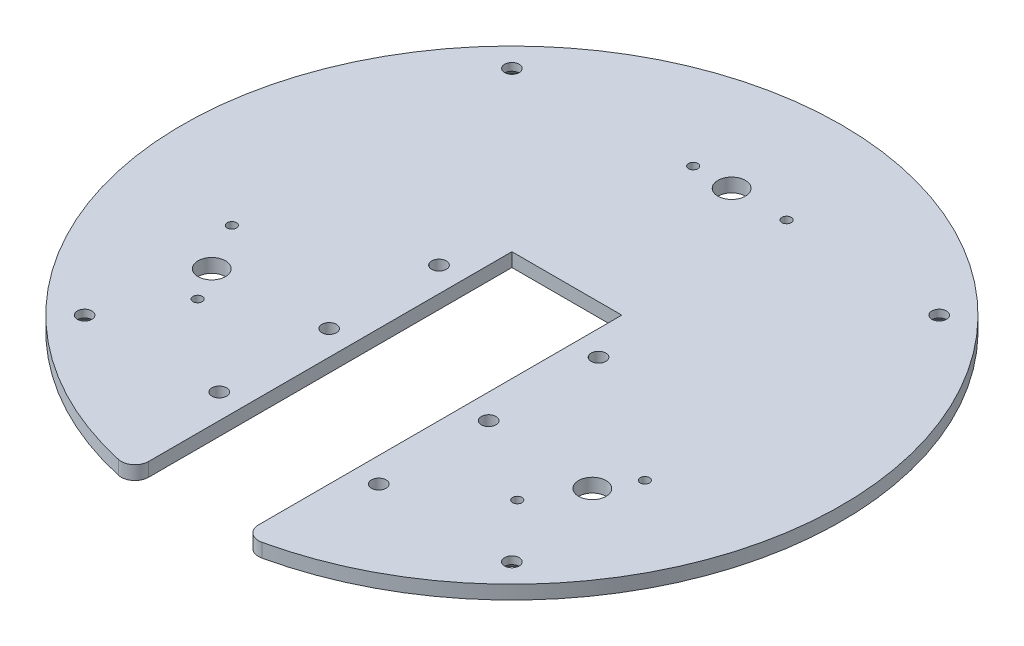
ISO-10303-21;
HEADER;
FILE_DESCRIPTION(('STEP AP214'),'2;1');
FILE_NAME('part.step','',(''),(''),'','','');
FILE_SCHEMA(('AUTOMOTIVE_DESIGN { 1 0 10303 214 1 1 1 1 }'));
ENDSEC;
DATA;
#1=APPLICATION_CONTEXT('core data for automotive mechanical design processes');
#2=APPLICATION_PROTOCOL_DEFINITION('international standard','automotive_design',2000,#1);
#3=PRODUCT_CONTEXT('',#1,'mechanical');
#4=PRODUCT('Part','Part','',(#3));
#5=PRODUCT_RELATED_PRODUCT_CATEGORY('part','',(#4));
#6=PRODUCT_DEFINITION_FORMATION('','',#4);
#7=PRODUCT_DEFINITION_CONTEXT('part definition',#1,'design');
#8=PRODUCT_DEFINITION('design','',#6,#7);
#9=PRODUCT_DEFINITION_SHAPE('','',#8);
#10=(LENGTH_UNIT() NAMED_UNIT(*) SI_UNIT(.MILLI.,.METRE.));
#11=(NAMED_UNIT(*) PLANE_ANGLE_UNIT() SI_UNIT($,.RADIAN.));
#12=(NAMED_UNIT(*) SI_UNIT($,.STERADIAN.) SOLID_ANGLE_UNIT());
#13=UNCERTAINTY_MEASURE_WITH_UNIT(LENGTH_MEASURE(1.E-05),#10,'distance_accuracy_value','');
#14=(GEOMETRIC_REPRESENTATION_CONTEXT(3) GLOBAL_UNCERTAINTY_ASSIGNED_CONTEXT((#13)) GLOBAL_UNIT_ASSIGNED_CONTEXT((#10,
#11,#12)) REPRESENTATION_CONTEXT('',''));
#15=CARTESIAN_POINT('',(0.,0.,0.));
#16=DIRECTION('',(0.,0.,1.));
#17=DIRECTION('',(1.,0.,0.));
#18=AXIS2_PLACEMENT_3D('',#15,#16,#17);
#19=CARTESIAN_POINT('',(-98.7828173317604,1.13686837721616E-10,-98.7828173317604));
#20=DIRECTION('',(0.,-1.,0.));
#21=DIRECTION('',(0.,0.,-1.));
#22=AXIS2_PLACEMENT_3D('',#19,#20,#21);
#23=CONICAL_SURFACE('',#22,6.22299999992661,0.785398163397448);
#24=CARTESIAN_POINT('',(-98.7828173317604,2.8448,-98.7828173317604));
#25=DIRECTION('',(0.,1.,0.));
#26=DIRECTION('',(0.,0.,1.));
#27=AXIS2_PLACEMENT_3D('',#24,#25,#26);
#28=CIRCLE('',#27,3.3782);
#29=CARTESIAN_POINT('',(-98.7828173317604,2.8448,-95.4046173317604));
#30=VERTEX_POINT('',#29);
#31=EDGE_CURVE('E126',#30,#30,#28,.T.);
#32=ORIENTED_EDGE('',*,*,#31,.T.);
#33=EDGE_LOOP('',(#32));
#34=FACE_BOUND('',#33,.T.);
#35=CARTESIAN_POINT('',(-98.7828173317604,5.6843418860808E-11,-98.7828173317604));
#36=DIRECTION('',(0.,-1.,0.));
#37=DIRECTION('',(0.,0.,-1.));
#38=AXIS2_PLACEMENT_3D('',#35,#36,#37);
#39=CIRCLE('',#38,6.22299999998345);
#40=CARTESIAN_POINT('',(-98.7828173317604,5.6843418860808E-11,-105.005817331744));
#41=VERTEX_POINT('',#40);
#42=EDGE_CURVE('E234',#41,#41,#39,.T.);
#43=ORIENTED_EDGE('',*,*,#42,.T.);
#44=EDGE_LOOP('',(#43));
#45=FACE_BOUND('',#44,.T.);
#46=ADVANCED_FACE('F16',(#34,#45),#23,.F.);
#47=CARTESIAN_POINT('',(-98.7828173317604,5.6843418860808E-11,98.7828173317604));
#48=DIRECTION('',(0.,-1.,0.));
#49=DIRECTION('',(0.,0.,-1.));
#50=AXIS2_PLACEMENT_3D('',#47,#48,#49);
#51=CONICAL_SURFACE('',#50,6.22299999997099,0.785398163397448);
#52=CARTESIAN_POINT('',(-98.7828173317604,2.8448,98.7828173317604));
#53=DIRECTION('',(0.,1.,0.));
#54=DIRECTION('',(0.,0.,1.));
#55=AXIS2_PLACEMENT_3D('',#52,#53,#54);
#56=CIRCLE('',#55,3.3782);
#57=CARTESIAN_POINT('',(-98.7828173317604,2.8448,102.16101733176));
#58=VERTEX_POINT('',#57);
#59=EDGE_CURVE('E123',#58,#58,#56,.T.);
#60=ORIENTED_EDGE('',*,*,#59,.T.);
#61=EDGE_LOOP('',(#60));
#62=FACE_BOUND('',#61,.T.);
#63=CARTESIAN_POINT('',(-98.7828173317604,-5.6843418860808E-11,98.7828173317604));
#64=DIRECTION('',(0.,-1.,0.));
#65=DIRECTION('',(0.,0.,-1.));
#66=AXIS2_PLACEMENT_3D('',#63,#64,#65);
#67=CIRCLE('',#66,6.22300000008467);
#68=CARTESIAN_POINT('',(-98.7828173317604,-5.6843418860808E-11,92.5598173316757));
#69=VERTEX_POINT('',#68);
#70=EDGE_CURVE('E231',#69,#69,#67,.T.);
#71=ORIENTED_EDGE('',*,*,#70,.T.);
#72=EDGE_LOOP('',(#71));
#73=FACE_BOUND('',#72,.T.);
#74=ADVANCED_FACE('F378',(#62,#73),#51,.F.);
#75=CARTESIAN_POINT('',(98.7828173317604,5.6843418860808E-11,98.7828173317604));
#76=DIRECTION('',(0.,-1.,0.));
#77=DIRECTION('',(0.,0.,-1.));
#78=AXIS2_PLACEMENT_3D('',#75,#76,#77);
#79=CONICAL_SURFACE('',#78,6.22299999997099,0.785398163397448);
#80=CARTESIAN_POINT('',(98.7828173317604,2.8448,98.7828173317604));
#81=DIRECTION('',(0.,1.,0.));
#82=DIRECTION('',(0.,0.,1.));
#83=AXIS2_PLACEMENT_3D('',#80,#81,#82);
#84=CIRCLE('',#83,3.3782);
#85=CARTESIAN_POINT('',(98.7828173317604,2.8448,102.16101733176));
#86=VERTEX_POINT('',#85);
#87=EDGE_CURVE('E120',#86,#86,#84,.T.);
#88=ORIENTED_EDGE('',*,*,#87,.T.);
#89=EDGE_LOOP('',(#88));
#90=FACE_BOUND('',#89,.T.);
#91=CARTESIAN_POINT('',(98.7828173317604,-5.6843418860808E-11,98.7828173317604));
#92=DIRECTION('',(0.,-1.,0.));
#93=DIRECTION('',(0.,0.,-1.));
#94=AXIS2_PLACEMENT_3D('',#91,#92,#93);
#95=CIRCLE('',#94,6.22300000008467);
#96=CARTESIAN_POINT('',(98.7828173317604,-5.6843418860808E-11,92.5598173316757));
#97=VERTEX_POINT('',#96);
#98=EDGE_CURVE('E88',#97,#97,#95,.T.);
#99=ORIENTED_EDGE('',*,*,#98,.T.);
#100=EDGE_LOOP('',(#99));
#101=FACE_BOUND('',#100,.T.);
#102=ADVANCED_FACE('F375',(#90,#101),#79,.F.);
#103=CARTESIAN_POINT('',(98.7828173317604,1.13686837721616E-10,-98.7828173317604));
#104=DIRECTION('',(0.,-1.,0.));
#105=DIRECTION('',(0.,0.,-1.));
#106=AXIS2_PLACEMENT_3D('',#103,#104,#105);
#107=CONICAL_SURFACE('',#106,6.22299999992661,0.785398163397448);
#108=CARTESIAN_POINT('',(98.7828173317604,2.8448,-98.7828173317604));
#109=DIRECTION('',(0.,1.,0.));
#110=DIRECTION('',(0.,0.,1.));
#111=AXIS2_PLACEMENT_3D('',#108,#109,#110);
#112=CIRCLE('',#111,3.3782);
#113=CARTESIAN_POINT('',(98.7828173317604,2.8448,-95.4046173317604));
#114=VERTEX_POINT('',#113);
#115=EDGE_CURVE('E117',#114,#114,#112,.T.);
#116=ORIENTED_EDGE('',*,*,#115,.T.);
#117=EDGE_LOOP('',(#116));
#118=FACE_BOUND('',#117,.T.);
#119=CARTESIAN_POINT('',(98.7828173317604,5.6843418860808E-11,-98.7828173317604));
#120=DIRECTION('',(0.,-1.,0.));
#121=DIRECTION('',(0.,0.,-1.));
#122=AXIS2_PLACEMENT_3D('',#119,#120,#121);
#123=CIRCLE('',#122,6.22299999998345);
#124=CARTESIAN_POINT('',(98.7828173317604,5.6843418860808E-11,-105.005817331744));
#125=VERTEX_POINT('',#124);
#126=EDGE_CURVE('E237',#125,#125,#123,.T.);
#127=ORIENTED_EDGE('',*,*,#126,.T.);
#128=EDGE_LOOP('',(#127));
#129=FACE_BOUND('',#128,.T.);
#130=ADVANCED_FACE('F369',(#118,#129),#107,.F.);
#131=CARTESIAN_POINT('',(-79.0981810245052,1.13686837721616E-10,66.1979316792846));
#132=DIRECTION('',(0.,-1.,0.));
#133=DIRECTION('',(0.,0.,-1.));
#134=AXIS2_PLACEMENT_3D('',#131,#132,#133);
#135=CONICAL_SURFACE('',#134,4.99744999993448,0.785398163387458);
#136=CARTESIAN_POINT('',(-79.0981810245052,2.8448,66.1979316792846));
#137=DIRECTION('',(0.,1.,0.));
#138=DIRECTION('',(0.,0.,1.));
#139=AXIS2_PLACEMENT_3D('',#136,#137,#138);
#140=CIRCLE('',#139,2.15265);
#141=CARTESIAN_POINT('',(-79.0981810245052,2.8448,68.3505816792846));
#142=VERTEX_POINT('',#141);
#143=EDGE_CURVE('E114',#142,#142,#140,.T.);
#144=ORIENTED_EDGE('',*,*,#143,.T.);
#145=EDGE_LOOP('',(#144));
#146=FACE_BOUND('',#145,.T.);
#147=CARTESIAN_POINT('',(-79.0981810245052,5.6843418860808E-11,66.1979316792846));
#148=DIRECTION('',(0.,-1.,0.));
#149=DIRECTION('',(0.,0.,-1.));
#150=AXIS2_PLACEMENT_3D('',#147,#148,#149);
#151=CIRCLE('',#150,4.99744999999133);
#152=CARTESIAN_POINT('',(-79.0981810245052,5.6843418860808E-11,61.2004816792933));
#153=VERTEX_POINT('',#152);
#154=EDGE_CURVE('E246',#153,#153,#151,.T.);
#155=ORIENTED_EDGE('',*,*,#154,.T.);
#156=EDGE_LOOP('',(#155));
#157=FACE_BOUND('',#156,.T.);
#158=ADVANCED_FACE('F360',(#146,#157),#135,.F.);
#159=CARTESIAN_POINT('',(-100.688181024505,2.27373675443232E-10,28.8029547438864));
#160=DIRECTION('',(0.,-1.,0.));
#161=DIRECTION('',(0.,0.,-1.));
#162=AXIS2_PLACEMENT_3D('',#159,#160,#161);
#163=CONICAL_SURFACE('',#162,4.99744999981112,0.785398163397448);
#164=CARTESIAN_POINT('',(-100.688181024505,2.8448,28.8029547438864));
#165=DIRECTION('',(0.,1.,0.));
#166=DIRECTION('',(0.,0.,1.));
#167=AXIS2_PLACEMENT_3D('',#164,#165,#166);
#168=CIRCLE('',#167,2.15265);
#169=CARTESIAN_POINT('',(-100.688181024505,2.8448,30.9556047438864));
#170=VERTEX_POINT('',#169);
#171=EDGE_CURVE('E111',#170,#170,#168,.T.);
#172=ORIENTED_EDGE('',*,*,#171,.T.);
#173=EDGE_LOOP('',(#172));
#174=FACE_BOUND('',#173,.T.);
#175=CARTESIAN_POINT('',(-100.688181024505,5.6843418860808E-11,28.8029547438864));
#176=DIRECTION('',(0.,-1.,0.));
#177=DIRECTION('',(0.,0.,-1.));
#178=AXIS2_PLACEMENT_3D('',#175,#176,#177);
#179=CIRCLE('',#178,4.99744999998165);
#180=CARTESIAN_POINT('',(-100.688181024505,5.6843418860808E-11,23.8055047439047));
#181=VERTEX_POINT('',#180);
#182=EDGE_CURVE('E249',#181,#181,#179,.T.);
#183=ORIENTED_EDGE('',*,*,#182,.T.);
#184=EDGE_LOOP('',(#183));
#185=FACE_BOUND('',#184,.T.);
#186=ADVANCED_FACE('F358',(#174,#185),#163,.F.);
#187=CARTESIAN_POINT('',(96.8781810245052,1.13686837721616E-10,35.4020683207154));
#188=DIRECTION('',(0.,-1.,0.));
#189=DIRECTION('',(0.,0.,-1.));
#190=AXIS2_PLACEMENT_3D('',#187,#188,#189);
#191=CONICAL_SURFACE('',#190,4.99744999991385,0.785398163387458);
#192=CARTESIAN_POINT('',(96.8781810245052,2.8448,35.4020683207154));
#193=DIRECTION('',(0.,1.,0.));
#194=DIRECTION('',(0.,0.,1.));
#195=AXIS2_PLACEMENT_3D('',#192,#193,#194);
#196=CIRCLE('',#195,2.15265);
#197=CARTESIAN_POINT('',(96.8781810245052,2.8448,37.5547183207154));
#198=VERTEX_POINT('',#197);
#199=EDGE_CURVE('E107',#198,#198,#196,.T.);
#200=ORIENTED_EDGE('',*,*,#199,.T.);
#201=EDGE_LOOP('',(#200));
#202=FACE_BOUND('',#201,.T.);
#203=CARTESIAN_POINT('',(96.8781810245052,5.6843418860808E-11,35.4020683207154));
#204=DIRECTION('',(0.,-1.,0.));
#205=DIRECTION('',(0.,0.,-1.));
#206=AXIS2_PLACEMENT_3D('',#203,#204,#205);
#207=CIRCLE('',#206,4.9974499999707);
#208=CARTESIAN_POINT('',(96.8781810245052,5.6843418860808E-11,30.4046183207447));
#209=VERTEX_POINT('',#208);
#210=EDGE_CURVE('E240',#209,#209,#207,.T.);
#211=ORIENTED_EDGE('',*,*,#210,.T.);
#212=EDGE_LOOP('',(#211));
#213=FACE_BOUND('',#212,.T.);
#214=ADVANCED_FACE('F348',(#202,#213),#191,.F.);
#215=CARTESIAN_POINT('',(75.2881810245052,1.13686837721616E-10,72.7970452561136));
#216=DIRECTION('',(0.,-1.,0.));
#217=DIRECTION('',(0.,0.,-1.));
#218=AXIS2_PLACEMENT_3D('',#215,#216,#217);
#219=CONICAL_SURFACE('',#218,4.99744999992353,0.785398163387458);
#220=CARTESIAN_POINT('',(75.2881810245052,2.8448,72.7970452561136));
#221=DIRECTION('',(0.,1.,0.));
#222=DIRECTION('',(0.,0.,1.));
#223=AXIS2_PLACEMENT_3D('',#220,#221,#222);
#224=CIRCLE('',#223,2.15265);
#225=CARTESIAN_POINT('',(75.2881810245052,2.8448,74.9496952561136));
#226=VERTEX_POINT('',#225);
#227=EDGE_CURVE('E104',#226,#226,#224,.T.);
#228=ORIENTED_EDGE('',*,*,#227,.T.);
#229=EDGE_LOOP('',(#228));
#230=FACE_BOUND('',#229,.T.);
#231=CARTESIAN_POINT('',(75.2881810245052,5.6843418860808E-11,72.7970452561136));
#232=DIRECTION('',(0.,-1.,0.));
#233=DIRECTION('',(0.,0.,-1.));
#234=AXIS2_PLACEMENT_3D('',#231,#232,#233);
#235=CIRCLE('',#234,4.99744999998038);
#236=CARTESIAN_POINT('',(75.2881810245052,5.6843418860808E-11,67.7995952561332));
#237=VERTEX_POINT('',#236);
#238=EDGE_CURVE('E243',#237,#237,#235,.T.);
#239=ORIENTED_EDGE('',*,*,#238,.T.);
#240=EDGE_LOOP('',(#239));
#241=FACE_BOUND('',#240,.T.);
#242=ADVANCED_FACE('F344',(#230,#241),#219,.F.);
#243=CARTESIAN_POINT('',(-17.78,1.13686837721616E-10,-101.6));
#244=DIRECTION('',(0.,-1.,0.));
#245=DIRECTION('',(0.,0.,-1.));
#246=AXIS2_PLACEMENT_3D('',#243,#244,#245);
#247=CONICAL_SURFACE('',#246,4.99744999986743,0.785398163387458);
#248=CARTESIAN_POINT('',(-17.78,2.8448,-101.6));
#249=DIRECTION('',(0.,1.,0.));
#250=DIRECTION('',(0.,0.,1.));
#251=AXIS2_PLACEMENT_3D('',#248,#249,#250);
#252=CIRCLE('',#251,2.15265);
#253=CARTESIAN_POINT('',(-17.78,2.8448,-99.44735));
#254=VERTEX_POINT('',#253);
#255=EDGE_CURVE('E100',#254,#254,#252,.T.);
#256=ORIENTED_EDGE('',*,*,#255,.T.);
#257=EDGE_LOOP('',(#256));
#258=FACE_BOUND('',#257,.T.);
#259=CARTESIAN_POINT('',(-17.78,0.,-101.6));
#260=DIRECTION('',(0.,-1.,0.));
#261=DIRECTION('',(0.,0.,-1.));
#262=AXIS2_PLACEMENT_3D('',#259,#260,#261);
#263=CIRCLE('',#262,4.99744999998111);
#264=CARTESIAN_POINT('',(-17.78,0.,-106.597449999981));
#265=VERTEX_POINT('',#264);
#266=EDGE_CURVE('E251',#265,#265,#263,.T.);
#267=ORIENTED_EDGE('',*,*,#266,.T.);
#268=EDGE_LOOP('',(#267));
#269=FACE_BOUND('',#268,.T.);
#270=ADVANCED_FACE('F347',(#258,#269),#247,.F.);
#271=CARTESIAN_POINT('',(25.4,1.13686837721616E-10,-101.6));
#272=DIRECTION('',(0.,-1.,0.));
#273=DIRECTION('',(0.,0.,-1.));
#274=AXIS2_PLACEMENT_3D('',#271,#272,#273);
#275=CONICAL_SURFACE('',#274,4.99744999986743,0.785398163387458);
#276=CARTESIAN_POINT('',(25.4,2.8448,-101.6));
#277=DIRECTION('',(0.,1.,0.));
#278=DIRECTION('',(0.,0.,1.));
#279=AXIS2_PLACEMENT_3D('',#276,#277,#278);
#280=CIRCLE('',#279,2.15265);
#281=CARTESIAN_POINT('',(25.4,2.8448,-99.44735));
#282=VERTEX_POINT('',#281);
#283=EDGE_CURVE('E96',#282,#282,#280,.T.);
#284=ORIENTED_EDGE('',*,*,#283,.T.);
#285=EDGE_LOOP('',(#284));
#286=FACE_BOUND('',#285,.T.);
#287=CARTESIAN_POINT('',(25.4,0.,-101.6));
#288=DIRECTION('',(0.,-1.,0.));
#289=DIRECTION('',(0.,0.,-1.));
#290=AXIS2_PLACEMENT_3D('',#287,#288,#289);
#291=CIRCLE('',#290,4.99744999998111);
#292=CARTESIAN_POINT('',(25.4,0.,-106.597449999981));
#293=VERTEX_POINT('',#292);
#294=EDGE_CURVE('E19',#293,#293,#291,.T.);
#295=ORIENTED_EDGE('',*,*,#294,.T.);
#296=EDGE_LOOP('',(#295));
#297=FACE_BOUND('',#296,.T.);
#298=ADVANCED_FACE('F258',(#286,#297),#275,.F.);
#299=CARTESIAN_POINT('',(0.,0.,0.));
#300=DIRECTION('',(0.,1.,0.));
#301=DIRECTION('',(0.,0.,1.));
#302=AXIS2_PLACEMENT_3D('',#299,#300,#301);
#303=PLANE('',#302);
#304=CARTESIAN_POINT('',(36.8808,0.,98.425));
#305=DIRECTION('',(0.,-1.,0.));
#306=DIRECTION('',(0.,0.,-1.));
#307=AXIS2_PLACEMENT_3D('',#304,#305,#306);
#308=CIRCLE('',#307,3.3782);
#309=CARTESIAN_POINT('',(36.8808,0.,95.0468));
#310=VERTEX_POINT('',#309);
#311=EDGE_CURVE('E204',#310,#310,#308,.F.);
#312=ORIENTED_EDGE('',*,*,#311,.T.);
#313=EDGE_LOOP('',(#312));
#314=FACE_BOUND('',#313,.T.);
#315=CARTESIAN_POINT('',(36.8808,0.,47.625));
#316=DIRECTION('',(0.,-1.,0.));
#317=DIRECTION('',(0.,0.,-1.));
#318=AXIS2_PLACEMENT_3D('',#315,#316,#317);
#319=CIRCLE('',#318,3.3782);
#320=CARTESIAN_POINT('',(36.8808,0.,44.2468));
#321=VERTEX_POINT('',#320);
#322=EDGE_CURVE('E207',#321,#321,#319,.F.);
#323=ORIENTED_EDGE('',*,*,#322,.T.);
#324=EDGE_LOOP('',(#323));
#325=FACE_BOUND('',#324,.T.);
#326=CARTESIAN_POINT('',(36.8808,0.,-3.175));
#327=DIRECTION('',(0.,-1.,0.));
#328=DIRECTION('',(0.,0.,-1.));
#329=AXIS2_PLACEMENT_3D('',#326,#327,#328);
#330=CIRCLE('',#329,3.3782);
#331=CARTESIAN_POINT('',(36.8808,0.,-6.5532));
#332=VERTEX_POINT('',#331);
#333=EDGE_CURVE('E210',#332,#332,#330,.F.);
#334=ORIENTED_EDGE('',*,*,#333,.T.);
#335=EDGE_LOOP('',(#334));
#336=FACE_BOUND('',#335,.T.);
#337=CARTESIAN_POINT('',(-36.8808,0.,-3.175));
#338=DIRECTION('',(0.,-1.,0.));
#339=DIRECTION('',(0.,0.,-1.));
#340=AXIS2_PLACEMENT_3D('',#337,#338,#339);
#341=CIRCLE('',#340,3.3782);
#342=CARTESIAN_POINT('',(-36.8808,0.,-6.5532));
#343=VERTEX_POINT('',#342);
#344=EDGE_CURVE('E213',#343,#343,#341,.F.);
#345=ORIENTED_EDGE('',*,*,#344,.T.);
#346=EDGE_LOOP('',(#345));
#347=FACE_BOUND('',#346,.T.);
#348=CARTESIAN_POINT('',(-36.8808,0.,47.625));
#349=DIRECTION('',(0.,-1.,0.));
#350=DIRECTION('',(0.,0.,-1.));
#351=AXIS2_PLACEMENT_3D('',#348,#349,#350);
#352=CIRCLE('',#351,3.3782);
#353=CARTESIAN_POINT('',(-36.8808,0.,44.2468));
#354=VERTEX_POINT('',#353);
#355=EDGE_CURVE('E216',#354,#354,#352,.F.);
#356=ORIENTED_EDGE('',*,*,#355,.T.);
#357=EDGE_LOOP('',(#356));
#358=FACE_BOUND('',#357,.T.);
#359=CARTESIAN_POINT('',(-36.8808,0.,98.425));
#360=DIRECTION('',(0.,-1.,0.));
#361=DIRECTION('',(0.,0.,-1.));
#362=AXIS2_PLACEMENT_3D('',#359,#360,#361);
#363=CIRCLE('',#362,3.3782);
#364=CARTESIAN_POINT('',(-36.8808,0.,95.0468));
#365=VERTEX_POINT('',#364);
#366=EDGE_CURVE('E219',#365,#365,#363,.F.);
#367=ORIENTED_EDGE('',*,*,#366,.T.);
#368=EDGE_LOOP('',(#367));
#369=FACE_BOUND('',#368,.T.);
#370=ORIENTED_EDGE('',*,*,#98,.F.);
#371=EDGE_LOOP('',(#370));
#372=FACE_BOUND('',#371,.T.);
#373=ORIENTED_EDGE('',*,*,#70,.F.);
#374=EDGE_LOOP('',(#373));
#375=FACE_BOUND('',#374,.T.);
#376=ORIENTED_EDGE('',*,*,#42,.F.);
#377=EDGE_LOOP('',(#376));
#378=FACE_BOUND('',#377,.T.);
#379=ORIENTED_EDGE('',*,*,#126,.F.);
#380=EDGE_LOOP('',(#379));
#381=FACE_BOUND('',#380,.T.);
#382=ORIENTED_EDGE('',*,*,#210,.F.);
#383=EDGE_LOOP('',(#382));
#384=FACE_BOUND('',#383,.T.);
#385=ORIENTED_EDGE('',*,*,#238,.F.);
#386=EDGE_LOOP('',(#385));
#387=FACE_BOUND('',#386,.T.);
#388=ORIENTED_EDGE('',*,*,#154,.F.);
#389=EDGE_LOOP('',(#388));
#390=FACE_BOUND('',#389,.T.);
#391=ORIENTED_EDGE('',*,*,#182,.F.);
#392=EDGE_LOOP('',(#391));
#393=FACE_BOUND('',#392,.T.);
#394=ORIENTED_EDGE('',*,*,#266,.F.);
#395=EDGE_LOOP('',(#394));
#396=FACE_BOUND('',#395,.T.);
#397=ORIENTED_EDGE('',*,*,#294,.F.);
#398=EDGE_LOOP('',(#397));
#399=FACE_BOUND('',#398,.T.);
#400=CARTESIAN_POINT('',(0.,0.,-101.6));
#401=DIRECTION('',(0.,1.,0.));
#402=DIRECTION('',(0.,0.,1.));
#403=AXIS2_PLACEMENT_3D('',#400,#401,#402);
#404=CIRCLE('',#403,6.35);
#405=CARTESIAN_POINT('',(0.,0.,-95.25));
#406=VERTEX_POINT('',#405);
#407=EDGE_CURVE('E99',#406,#406,#404,.T.);
#408=ORIENTED_EDGE('',*,*,#407,.T.);
#409=EDGE_LOOP('',(#408));
#410=FACE_BOUND('',#409,.T.);
#411=CARTESIAN_POINT('',(87.9881810245052,0.,50.8));
#412=DIRECTION('',(0.,1.,0.));
#413=DIRECTION('',(0.,0.,1.));
#414=AXIS2_PLACEMENT_3D('',#411,#412,#413);
#415=CIRCLE('',#414,6.35);
#416=CARTESIAN_POINT('',(87.9881810245052,0.,57.15));
#417=VERTEX_POINT('',#416);
#418=EDGE_CURVE('E103',#417,#417,#415,.T.);
#419=ORIENTED_EDGE('',*,*,#418,.T.);
#420=EDGE_LOOP('',(#419));
#421=FACE_BOUND('',#420,.T.);
#422=CARTESIAN_POINT('',(-87.9881810245052,0.,50.8));
#423=DIRECTION('',(0.,1.,0.));
#424=DIRECTION('',(0.,0.,1.));
#425=AXIS2_PLACEMENT_3D('',#422,#423,#424);
#426=CIRCLE('',#425,6.35);
#427=CARTESIAN_POINT('',(-87.9881810245052,0.,57.15));
#428=VERTEX_POINT('',#427);
#429=EDGE_CURVE('E110',#428,#428,#426,.T.);
#430=ORIENTED_EDGE('',*,*,#429,.T.);
#431=EDGE_LOOP('',(#430));
#432=FACE_BOUND('',#431,.T.);
#433=CARTESIAN_POINT('',(31.75,0.,142.557146436089));
#434=DIRECTION('',(0.,-1.,0.));
#435=DIRECTION('',(0.,0.,-1.));
#436=AXIS2_PLACEMENT_3D('',#433,#434,#435);
#437=CIRCLE('',#436,6.35);
#438=CARTESIAN_POINT('',(25.4,0.,142.557146436089));
#439=VERTEX_POINT('',#438);
#440=CARTESIAN_POINT('',(33.1304347826091,0.,148.755283237657));
#441=VERTEX_POINT('',#440);
#442=EDGE_CURVE('E70',#439,#441,#437,.F.);
#443=ORIENTED_EDGE('',*,*,#442,.F.);
#444=DIRECTION('',(0.,0.,-1.));
#445=VECTOR('',#444,1.);
#446=CARTESIAN_POINT('',(25.4,0.,0.));
#447=LINE('',#446,#445);
#448=CARTESIAN_POINT('',(25.4,0.,-25.4));
#449=VERTEX_POINT('',#448);
#450=EDGE_CURVE('E129',#439,#449,#447,.T.);
#451=ORIENTED_EDGE('',*,*,#450,.T.);
#452=DIRECTION('',(-1.,0.,0.));
#453=VECTOR('',#452,1.);
#454=CARTESIAN_POINT('',(0.,0.,-25.4));
#455=LINE('',#454,#453);
#456=CARTESIAN_POINT('',(-25.4,0.,-25.4));
#457=VERTEX_POINT('',#456);
#458=EDGE_CURVE('E134',#449,#457,#455,.T.);
#459=ORIENTED_EDGE('',*,*,#458,.T.);
#460=DIRECTION('',(0.,0.,-1.));
#461=VECTOR('',#460,1.);
#462=CARTESIAN_POINT('',(-25.4,0.,0.));
#463=LINE('',#462,#461);
#464=CARTESIAN_POINT('',(-25.4,0.,142.557146436089));
#465=VERTEX_POINT('',#464);
#466=EDGE_CURVE('E136',#465,#457,#463,.T.);
#467=ORIENTED_EDGE('',*,*,#466,.F.);
#468=CARTESIAN_POINT('',(-31.75,0.,142.557146436089));
#469=DIRECTION('',(0.,-1.,0.));
#470=DIRECTION('',(0.,0.,-1.));
#471=AXIS2_PLACEMENT_3D('',#468,#469,#470);
#472=CIRCLE('',#471,6.35);
#473=CARTESIAN_POINT('',(-33.1304347825849,0.,148.755283237663));
#474=VERTEX_POINT('',#473);
#475=EDGE_CURVE('E73',#474,#465,#472,.F.);
#476=ORIENTED_EDGE('',*,*,#475,.F.);
#477=CARTESIAN_POINT('',(0.,0.,0.));
#478=DIRECTION('',(0.,-1.,0.));
#479=DIRECTION('',(0.,0.,-1.));
#480=AXIS2_PLACEMENT_3D('',#477,#478,#479);
#481=CIRCLE('',#480,152.4);
#482=EDGE_CURVE('E67',#441,#474,#481,.F.);
#483=ORIENTED_EDGE('',*,*,#482,.F.);
#484=EDGE_LOOP('',(#443,#451,#459,#467,#476,#483));
#485=FACE_BOUND('',#484,.T.);
#486=ADVANCED_FACE('F69',(#314,#325,#336,#347,#358,#369,#372,#375,#378,#381,#384,#387,#390,#393,
#396,#399,#410,#421,#432,#485),#303,.F.);
#487=CARTESIAN_POINT('',(31.75,6.35,142.557146436089));
#488=DIRECTION('',(0.,-1.,0.));
#489=DIRECTION('',(0.,0.,-1.));
#490=AXIS2_PLACEMENT_3D('',#487,#488,#489);
#491=CYLINDRICAL_SURFACE('',#490,6.35);
#492=DIRECTION('',(0.,-1.,0.));
#493=VECTOR('',#492,1.);
#494=CARTESIAN_POINT('',(33.1304347826095,6.35,148.755283237656));
#495=LINE('',#494,#493);
#496=CARTESIAN_POINT('',(33.1304347826091,6.35,148.755283237657));
#497=VERTEX_POINT('',#496);
#498=EDGE_CURVE('E79',#497,#441,#495,.T.);
#499=ORIENTED_EDGE('',*,*,#498,.F.);
#500=CARTESIAN_POINT('',(31.75,6.35,142.557146436089));
#501=DIRECTION('',(0.,-1.,0.));
#502=DIRECTION('',(0.,0.,-1.));
#503=AXIS2_PLACEMENT_3D('',#500,#501,#502);
#504=CIRCLE('',#503,6.35);
#505=CARTESIAN_POINT('',(25.4,6.35,142.557146436089));
#506=VERTEX_POINT('',#505);
#507=EDGE_CURVE('E202',#506,#497,#504,.F.);
#508=ORIENTED_EDGE('',*,*,#507,.F.);
#509=DIRECTION('',(0.,1.,0.));
#510=VECTOR('',#509,1.);
#511=CARTESIAN_POINT('',(25.4,6.35,142.557146436089));
#512=LINE('',#511,#510);
#513=EDGE_CURVE('E86',#506,#439,#512,.F.);
#514=ORIENTED_EDGE('',*,*,#513,.T.);
#515=ORIENTED_EDGE('',*,*,#442,.T.);
#516=EDGE_LOOP('',(#499,#508,#514,#515));
#517=FACE_BOUND('',#516,.T.);
#518=ADVANCED_FACE('F83',(#517),#491,.T.);
#519=CARTESIAN_POINT('',(0.,6.35,0.));
#520=DIRECTION('',(0.,-1.,0.));
#521=DIRECTION('',(0.,0.,-1.));
#522=AXIS2_PLACEMENT_3D('',#519,#520,#521);
#523=CYLINDRICAL_SURFACE('',#522,152.4);
#524=DIRECTION('',(0.,-1.,0.));
#525=VECTOR('',#524,1.);
#526=CARTESIAN_POINT('',(-33.1304347825616,6.35,148.755283237669));
#527=LINE('',#526,#525);
#528=CARTESIAN_POINT('',(-33.1304347825851,6.35,148.755283237664));
#529=VERTEX_POINT('',#528);
#530=EDGE_CURVE('E78',#529,#474,#527,.T.);
#531=ORIENTED_EDGE('',*,*,#530,.F.);
#532=CARTESIAN_POINT('',(0.,6.35,0.));
#533=DIRECTION('',(0.,-1.,0.));
#534=DIRECTION('',(0.,0.,-1.));
#535=AXIS2_PLACEMENT_3D('',#532,#533,#534);
#536=CIRCLE('',#535,152.4);
#537=EDGE_CURVE('E91',#497,#529,#536,.F.);
#538=ORIENTED_EDGE('',*,*,#537,.F.);
#539=ORIENTED_EDGE('',*,*,#498,.T.);
#540=ORIENTED_EDGE('',*,*,#482,.T.);
#541=EDGE_LOOP('',(#531,#538,#539,#540));
#542=FACE_BOUND('',#541,.T.);
#543=ADVANCED_FACE('F90',(#542),#523,.T.);
#544=CARTESIAN_POINT('',(-31.75,6.35,142.557146436089));
#545=DIRECTION('',(0.,-1.,0.));
#546=DIRECTION('',(0.,0.,-1.));
#547=AXIS2_PLACEMENT_3D('',#544,#545,#546);
#548=CYLINDRICAL_SURFACE('',#547,6.35);
#549=DIRECTION('',(0.,1.,0.));
#550=VECTOR('',#549,1.);
#551=CARTESIAN_POINT('',(-25.4,6.35,142.557146436089));
#552=LINE('',#551,#550);
#553=CARTESIAN_POINT('',(-25.4,6.35,142.557146436089));
#554=VERTEX_POINT('',#553);
#555=EDGE_CURVE('E141',#554,#465,#552,.F.);
#556=ORIENTED_EDGE('',*,*,#555,.F.);
#557=CARTESIAN_POINT('',(-31.75,6.35,142.557146436089));
#558=DIRECTION('',(0.,-1.,0.));
#559=DIRECTION('',(0.,0.,-1.));
#560=AXIS2_PLACEMENT_3D('',#557,#558,#559);
#561=CIRCLE('',#560,6.35);
#562=EDGE_CURVE('E198',#529,#554,#561,.F.);
#563=ORIENTED_EDGE('',*,*,#562,.F.);
#564=ORIENTED_EDGE('',*,*,#530,.T.);
#565=ORIENTED_EDGE('',*,*,#475,.T.);
#566=EDGE_LOOP('',(#556,#563,#564,#565));
#567=FACE_BOUND('',#566,.T.);
#568=ADVANCED_FACE('F428',(#567),#548,.T.);
#569=CARTESIAN_POINT('',(-25.4,6.35,0.));
#570=DIRECTION('',(1.,0.,0.));
#571=DIRECTION('',(0.,0.,-1.));
#572=AXIS2_PLACEMENT_3D('',#569,#570,#571);
#573=PLANE('',#572);
#574=DIRECTION('',(0.,1.,0.));
#575=VECTOR('',#574,1.);
#576=CARTESIAN_POINT('',(-25.4,6.35,-25.4));
#577=LINE('',#576,#575);
#578=CARTESIAN_POINT('',(-25.4,6.35,-25.4));
#579=VERTEX_POINT('',#578);
#580=EDGE_CURVE('E131',#457,#579,#577,.T.);
#581=ORIENTED_EDGE('',*,*,#580,.T.);
#582=DIRECTION('',(0.,0.,1.));
#583=VECTOR('',#582,1.);
#584=CARTESIAN_POINT('',(-25.4,6.35,0.));
#585=LINE('',#584,#583);
#586=EDGE_CURVE('E200',#554,#579,#585,.F.);
#587=ORIENTED_EDGE('',*,*,#586,.F.);
#588=ORIENTED_EDGE('',*,*,#555,.T.);
#589=ORIENTED_EDGE('',*,*,#466,.T.);
#590=EDGE_LOOP('',(#581,#587,#588,#589));
#591=FACE_BOUND('',#590,.T.);
#592=ADVANCED_FACE('F425',(#591),#573,.T.);
#593=CARTESIAN_POINT('',(0.,6.35,-25.4));
#594=DIRECTION('',(0.,0.,-1.));
#595=DIRECTION('',(-1.,0.,0.));
#596=AXIS2_PLACEMENT_3D('',#593,#594,#595);
#597=PLANE('',#596);
#598=DIRECTION('',(1.,0.,0.));
#599=VECTOR('',#598,1.);
#600=CARTESIAN_POINT('',(0.,6.35,-25.4));
#601=LINE('',#600,#599);
#602=CARTESIAN_POINT('',(25.4,6.35,-25.4));
#603=VERTEX_POINT('',#602);
#604=EDGE_CURVE('E622',#579,#603,#601,.T.);
#605=ORIENTED_EDGE('',*,*,#604,.F.);
#606=ORIENTED_EDGE('',*,*,#580,.F.);
#607=ORIENTED_EDGE('',*,*,#458,.F.);
#608=DIRECTION('',(0.,1.,0.));
#609=VECTOR('',#608,1.);
#610=CARTESIAN_POINT('',(25.4,6.35,-25.4));
#611=LINE('',#610,#609);
#612=EDGE_CURVE('E34',#449,#603,#611,.T.);
#613=ORIENTED_EDGE('',*,*,#612,.T.);
#614=EDGE_LOOP('',(#605,#606,#607,#613));
#615=FACE_BOUND('',#614,.T.);
#616=ADVANCED_FACE('F421',(#615),#597,.F.);
#617=CARTESIAN_POINT('',(25.4,6.35,0.));
#618=DIRECTION('',(1.,0.,0.));
#619=DIRECTION('',(0.,0.,-1.));
#620=AXIS2_PLACEMENT_3D('',#617,#618,#619);
#621=PLANE('',#620);
#622=DIRECTION('',(0.,0.,1.));
#623=VECTOR('',#622,1.);
#624=CARTESIAN_POINT('',(25.4,6.35,0.));
#625=LINE('',#624,#623);
#626=EDGE_CURVE('E197',#603,#506,#625,.T.);
#627=ORIENTED_EDGE('',*,*,#626,.F.);
#628=ORIENTED_EDGE('',*,*,#612,.F.);
#629=ORIENTED_EDGE('',*,*,#450,.F.);
#630=ORIENTED_EDGE('',*,*,#513,.F.);
#631=EDGE_LOOP('',(#627,#628,#629,#630));
#632=FACE_BOUND('',#631,.T.);
#633=ADVANCED_FACE('F413',(#632),#621,.F.);
#634=CARTESIAN_POINT('',(-98.7828173317604,0.,-98.7828173317604));
#635=DIRECTION('',(0.,1.,0.));
#636=DIRECTION('',(0.,0.,1.));
#637=AXIS2_PLACEMENT_3D('',#634,#635,#636);
#638=CYLINDRICAL_SURFACE('',#637,3.3782);
#639=CARTESIAN_POINT('',(-98.7828173317604,6.35,-98.7828173317604));
#640=DIRECTION('',(0.,1.,0.));
#641=DIRECTION('',(0.,0.,1.));
#642=AXIS2_PLACEMENT_3D('',#639,#640,#641);
#643=CIRCLE('',#642,3.3782);
#644=CARTESIAN_POINT('',(-98.7828173317604,6.35,-95.4046173317604));
#645=VERTEX_POINT('',#644);
#646=EDGE_CURVE('E194',#645,#645,#643,.F.);
#647=ORIENTED_EDGE('',*,*,#646,.F.);
#648=EDGE_LOOP('',(#647));
#649=FACE_BOUND('',#648,.T.);
#650=ORIENTED_EDGE('',*,*,#31,.F.);
#651=EDGE_LOOP('',(#650));
#652=FACE_BOUND('',#651,.T.);
#653=ADVANCED_FACE('F403',(#649,#652),#638,.F.);
#654=CARTESIAN_POINT('',(-98.7828173317604,0.,98.7828173317604));
#655=DIRECTION('',(0.,1.,0.));
#656=DIRECTION('',(0.,0.,1.));
#657=AXIS2_PLACEMENT_3D('',#654,#655,#656);
#658=CYLINDRICAL_SURFACE('',#657,3.3782);
#659=CARTESIAN_POINT('',(-98.7828173317604,6.35,98.7828173317604));
#660=DIRECTION('',(0.,1.,0.));
#661=DIRECTION('',(0.,0.,1.));
#662=AXIS2_PLACEMENT_3D('',#659,#660,#661);
#663=CIRCLE('',#662,3.3782);
#664=CARTESIAN_POINT('',(-98.7828173317604,6.35,102.16101733176));
#665=VERTEX_POINT('',#664);
#666=EDGE_CURVE('E191',#665,#665,#663,.F.);
#667=ORIENTED_EDGE('',*,*,#666,.F.);
#668=EDGE_LOOP('',(#667));
#669=FACE_BOUND('',#668,.T.);
#670=ORIENTED_EDGE('',*,*,#59,.F.);
#671=EDGE_LOOP('',(#670));
#672=FACE_BOUND('',#671,.T.);
#673=ADVANCED_FACE('F400',(#669,#672),#658,.F.);
#674=CARTESIAN_POINT('',(98.7828173317604,0.,98.7828173317604));
#675=DIRECTION('',(0.,1.,0.));
#676=DIRECTION('',(0.,0.,1.));
#677=AXIS2_PLACEMENT_3D('',#674,#675,#676);
#678=CYLINDRICAL_SURFACE('',#677,3.3782);
#679=CARTESIAN_POINT('',(98.7828173317604,6.35,98.7828173317604));
#680=DIRECTION('',(0.,1.,0.));
#681=DIRECTION('',(0.,0.,1.));
#682=AXIS2_PLACEMENT_3D('',#679,#680,#681);
#683=CIRCLE('',#682,3.3782);
#684=CARTESIAN_POINT('',(98.7828173317604,6.35,102.16101733176));
#685=VERTEX_POINT('',#684);
#686=EDGE_CURVE('E188',#685,#685,#683,.F.);
#687=ORIENTED_EDGE('',*,*,#686,.F.);
#688=EDGE_LOOP('',(#687));
#689=FACE_BOUND('',#688,.T.);
#690=ORIENTED_EDGE('',*,*,#87,.F.);
#691=EDGE_LOOP('',(#690));
#692=FACE_BOUND('',#691,.T.);
#693=ADVANCED_FACE('F402',(#689,#692),#678,.F.);
#694=CARTESIAN_POINT('',(98.7828173317604,0.,-98.7828173317604));
#695=DIRECTION('',(0.,1.,0.));
#696=DIRECTION('',(0.,0.,1.));
#697=AXIS2_PLACEMENT_3D('',#694,#695,#696);
#698=CYLINDRICAL_SURFACE('',#697,3.3782);
#699=CARTESIAN_POINT('',(98.7828173317604,6.35,-98.7828173317604));
#700=DIRECTION('',(0.,1.,0.));
#701=DIRECTION('',(0.,0.,1.));
#702=AXIS2_PLACEMENT_3D('',#699,#700,#701);
#703=CIRCLE('',#702,3.3782);
#704=CARTESIAN_POINT('',(98.7828173317604,6.35,-95.4046173317604));
#705=VERTEX_POINT('',#704);
#706=EDGE_CURVE('E185',#705,#705,#703,.F.);
#707=ORIENTED_EDGE('',*,*,#706,.F.);
#708=EDGE_LOOP('',(#707));
#709=FACE_BOUND('',#708,.T.);
#710=ORIENTED_EDGE('',*,*,#115,.F.);
#711=EDGE_LOOP('',(#710));
#712=FACE_BOUND('',#711,.T.);
#713=ADVANCED_FACE('F410',(#709,#712),#698,.F.);
#714=CARTESIAN_POINT('',(-79.0981810245052,0.,66.1979316792846));
#715=DIRECTION('',(0.,1.,0.));
#716=DIRECTION('',(0.,0.,1.));
#717=AXIS2_PLACEMENT_3D('',#714,#715,#716);
#718=CYLINDRICAL_SURFACE('',#717,2.15265);
#719=CARTESIAN_POINT('',(-79.0981810245052,6.35,66.1979316792846));
#720=DIRECTION('',(0.,1.,0.));
#721=DIRECTION('',(0.,0.,1.));
#722=AXIS2_PLACEMENT_3D('',#719,#720,#721);
#723=CIRCLE('',#722,2.15265);
#724=CARTESIAN_POINT('',(-79.0981810245052,6.35,68.3505816792846));
#725=VERTEX_POINT('',#724);
#726=EDGE_CURVE('E182',#725,#725,#723,.F.);
#727=ORIENTED_EDGE('',*,*,#726,.F.);
#728=EDGE_LOOP('',(#727));
#729=FACE_BOUND('',#728,.T.);
#730=ORIENTED_EDGE('',*,*,#143,.F.);
#731=EDGE_LOOP('',(#730));
#732=FACE_BOUND('',#731,.T.);
#733=ADVANCED_FACE('F284',(#729,#732),#718,.F.);
#734=CARTESIAN_POINT('',(-100.688181024505,0.,28.8029547438864));
#735=DIRECTION('',(0.,1.,0.));
#736=DIRECTION('',(0.,0.,1.));
#737=AXIS2_PLACEMENT_3D('',#734,#735,#736);
#738=CYLINDRICAL_SURFACE('',#737,2.15265);
#739=CARTESIAN_POINT('',(-100.688181024505,6.35,28.8029547438864));
#740=DIRECTION('',(0.,1.,0.));
#741=DIRECTION('',(0.,0.,1.));
#742=AXIS2_PLACEMENT_3D('',#739,#740,#741);
#743=CIRCLE('',#742,2.15265);
#744=CARTESIAN_POINT('',(-100.688181024505,6.35,30.9556047438864));
#745=VERTEX_POINT('',#744);
#746=EDGE_CURVE('E179',#745,#745,#743,.F.);
#747=ORIENTED_EDGE('',*,*,#746,.F.);
#748=EDGE_LOOP('',(#747));
#749=FACE_BOUND('',#748,.T.);
#750=ORIENTED_EDGE('',*,*,#171,.F.);
#751=EDGE_LOOP('',(#750));
#752=FACE_BOUND('',#751,.T.);
#753=ADVANCED_FACE('F273',(#749,#752),#738,.F.);
#754=CARTESIAN_POINT('',(-87.9881810245052,0.,50.8));
#755=DIRECTION('',(0.,1.,0.));
#756=DIRECTION('',(0.,0.,1.));
#757=AXIS2_PLACEMENT_3D('',#754,#755,#756);
#758=CYLINDRICAL_SURFACE('',#757,6.35);
#759=CARTESIAN_POINT('',(-87.9881810245052,6.35,50.8));
#760=DIRECTION('',(0.,1.,0.));
#761=DIRECTION('',(0.,0.,1.));
#762=AXIS2_PLACEMENT_3D('',#759,#760,#761);
#763=CIRCLE('',#762,6.35);
#764=CARTESIAN_POINT('',(-87.9881810245052,6.35,57.15));
#765=VERTEX_POINT('',#764);
#766=EDGE_CURVE('E176',#765,#765,#763,.F.);
#767=ORIENTED_EDGE('',*,*,#766,.F.);
#768=EDGE_LOOP('',(#767));
#769=FACE_BOUND('',#768,.T.);
#770=ORIENTED_EDGE('',*,*,#429,.F.);
#771=EDGE_LOOP('',(#770));
#772=FACE_BOUND('',#771,.T.);
#773=ADVANCED_FACE('F270',(#769,#772),#758,.F.);
#774=CARTESIAN_POINT('',(96.8781810245052,0.,35.4020683207154));
#775=DIRECTION('',(0.,1.,0.));
#776=DIRECTION('',(0.,0.,1.));
#777=AXIS2_PLACEMENT_3D('',#774,#775,#776);
#778=CYLINDRICAL_SURFACE('',#777,2.15265);
#779=CARTESIAN_POINT('',(96.8781810245052,6.35,35.4020683207154));
#780=DIRECTION('',(0.,1.,0.));
#781=DIRECTION('',(0.,0.,1.));
#782=AXIS2_PLACEMENT_3D('',#779,#780,#781);
#783=CIRCLE('',#782,2.15265);
#784=CARTESIAN_POINT('',(96.8781810245052,6.35,37.5547183207154));
#785=VERTEX_POINT('',#784);
#786=EDGE_CURVE('E173',#785,#785,#783,.F.);
#787=ORIENTED_EDGE('',*,*,#786,.F.);
#788=EDGE_LOOP('',(#787));
#789=FACE_BOUND('',#788,.T.);
#790=ORIENTED_EDGE('',*,*,#199,.F.);
#791=EDGE_LOOP('',(#790));
#792=FACE_BOUND('',#791,.T.);
#793=ADVANCED_FACE('F272',(#789,#792),#778,.F.);
#794=CARTESIAN_POINT('',(75.2881810245052,0.,72.7970452561136));
#795=DIRECTION('',(0.,1.,0.));
#796=DIRECTION('',(0.,0.,1.));
#797=AXIS2_PLACEMENT_3D('',#794,#795,#796);
#798=CYLINDRICAL_SURFACE('',#797,2.15265);
#799=CARTESIAN_POINT('',(75.2881810245052,6.35,72.7970452561136));
#800=DIRECTION('',(0.,1.,0.));
#801=DIRECTION('',(0.,0.,1.));
#802=AXIS2_PLACEMENT_3D('',#799,#800,#801);
#803=CIRCLE('',#802,2.15265);
#804=CARTESIAN_POINT('',(75.2881810245052,6.35,74.9496952561136));
#805=VERTEX_POINT('',#804);
#806=EDGE_CURVE('E170',#805,#805,#803,.F.);
#807=ORIENTED_EDGE('',*,*,#806,.F.);
#808=EDGE_LOOP('',(#807));
#809=FACE_BOUND('',#808,.T.);
#810=ORIENTED_EDGE('',*,*,#227,.F.);
#811=EDGE_LOOP('',(#810));
#812=FACE_BOUND('',#811,.T.);
#813=ADVANCED_FACE('F281',(#809,#812),#798,.F.);
#814=CARTESIAN_POINT('',(87.9881810245052,0.,50.8));
#815=DIRECTION('',(0.,1.,0.));
#816=DIRECTION('',(0.,0.,1.));
#817=AXIS2_PLACEMENT_3D('',#814,#815,#816);
#818=CYLINDRICAL_SURFACE('',#817,6.35);
#819=CARTESIAN_POINT('',(87.9881810245052,6.35,50.8));
#820=DIRECTION('',(0.,1.,0.));
#821=DIRECTION('',(0.,0.,1.));
#822=AXIS2_PLACEMENT_3D('',#819,#820,#821);
#823=CIRCLE('',#822,6.35);
#824=CARTESIAN_POINT('',(87.9881810245052,6.35,57.15));
#825=VERTEX_POINT('',#824);
#826=EDGE_CURVE('E167',#825,#825,#823,.F.);
#827=ORIENTED_EDGE('',*,*,#826,.F.);
#828=EDGE_LOOP('',(#827));
#829=FACE_BOUND('',#828,.T.);
#830=ORIENTED_EDGE('',*,*,#418,.F.);
#831=EDGE_LOOP('',(#830));
#832=FACE_BOUND('',#831,.T.);
#833=ADVANCED_FACE('F331',(#829,#832),#818,.F.);
#834=CARTESIAN_POINT('',(-17.78,0.,-101.6));
#835=DIRECTION('',(0.,1.,0.));
#836=DIRECTION('',(0.,0.,1.));
#837=AXIS2_PLACEMENT_3D('',#834,#835,#836);
#838=CYLINDRICAL_SURFACE('',#837,2.15265);
#839=CARTESIAN_POINT('',(-17.78,6.35,-101.6));
#840=DIRECTION('',(0.,1.,0.));
#841=DIRECTION('',(0.,0.,1.));
#842=AXIS2_PLACEMENT_3D('',#839,#840,#841);
#843=CIRCLE('',#842,2.15265);
#844=CARTESIAN_POINT('',(-17.78,6.35,-99.44735));
#845=VERTEX_POINT('',#844);
#846=EDGE_CURVE('E164',#845,#845,#843,.F.);
#847=ORIENTED_EDGE('',*,*,#846,.F.);
#848=EDGE_LOOP('',(#847));
#849=FACE_BOUND('',#848,.T.);
#850=ORIENTED_EDGE('',*,*,#255,.F.);
#851=EDGE_LOOP('',(#850));
#852=FACE_BOUND('',#851,.T.);
#853=ADVANCED_FACE('F327',(#849,#852),#838,.F.);
#854=CARTESIAN_POINT('',(25.4,0.,-101.6));
#855=DIRECTION('',(0.,1.,0.));
#856=DIRECTION('',(0.,0.,1.));
#857=AXIS2_PLACEMENT_3D('',#854,#855,#856);
#858=CYLINDRICAL_SURFACE('',#857,2.15265);
#859=CARTESIAN_POINT('',(25.4,6.35,-101.6));
#860=DIRECTION('',(0.,1.,0.));
#861=DIRECTION('',(0.,0.,1.));
#862=AXIS2_PLACEMENT_3D('',#859,#860,#861);
#863=CIRCLE('',#862,2.15265);
#864=CARTESIAN_POINT('',(25.4,6.35,-99.44735));
#865=VERTEX_POINT('',#864);
#866=EDGE_CURVE('E161',#865,#865,#863,.F.);
#867=ORIENTED_EDGE('',*,*,#866,.F.);
#868=EDGE_LOOP('',(#867));
#869=FACE_BOUND('',#868,.T.);
#870=ORIENTED_EDGE('',*,*,#283,.F.);
#871=EDGE_LOOP('',(#870));
#872=FACE_BOUND('',#871,.T.);
#873=ADVANCED_FACE('F323',(#869,#872),#858,.F.);
#874=CARTESIAN_POINT('',(0.,0.,-101.6));
#875=DIRECTION('',(0.,1.,0.));
#876=DIRECTION('',(0.,0.,1.));
#877=AXIS2_PLACEMENT_3D('',#874,#875,#876);
#878=CYLINDRICAL_SURFACE('',#877,6.35);
#879=CARTESIAN_POINT('',(0.,6.35,-101.6));
#880=DIRECTION('',(0.,1.,0.));
#881=DIRECTION('',(0.,0.,1.));
#882=AXIS2_PLACEMENT_3D('',#879,#880,#881);
#883=CIRCLE('',#882,6.35);
#884=CARTESIAN_POINT('',(0.,6.35,-95.25));
#885=VERTEX_POINT('',#884);
#886=EDGE_CURVE('E158',#885,#885,#883,.F.);
#887=ORIENTED_EDGE('',*,*,#886,.F.);
#888=EDGE_LOOP('',(#887));
#889=FACE_BOUND('',#888,.T.);
#890=ORIENTED_EDGE('',*,*,#407,.F.);
#891=EDGE_LOOP('',(#890));
#892=FACE_BOUND('',#891,.T.);
#893=ADVANCED_FACE('F319',(#889,#892),#878,.F.);
#894=CARTESIAN_POINT('',(-36.8808,0.,98.425));
#895=DIRECTION('',(0.,-1.,0.));
#896=DIRECTION('',(0.,0.,-1.));
#897=AXIS2_PLACEMENT_3D('',#894,#895,#896);
#898=CYLINDRICAL_SURFACE('',#897,3.3782);
#899=ORIENTED_EDGE('',*,*,#366,.F.);
#900=EDGE_LOOP('',(#899));
#901=FACE_BOUND('',#900,.T.);
#902=CARTESIAN_POINT('',(-36.8808,6.35,98.425));
#903=DIRECTION('',(0.,-1.,0.));
#904=DIRECTION('',(0.,0.,-1.));
#905=AXIS2_PLACEMENT_3D('',#902,#903,#904);
#906=CIRCLE('',#905,3.3782);
#907=CARTESIAN_POINT('',(-36.8808,6.35,95.0468));
#908=VERTEX_POINT('',#907);
#909=EDGE_CURVE('E155',#908,#908,#906,.T.);
#910=ORIENTED_EDGE('',*,*,#909,.F.);
#911=EDGE_LOOP('',(#910));
#912=FACE_BOUND('',#911,.T.);
#913=ADVANCED_FACE('F315',(#901,#912),#898,.F.);
#914=CARTESIAN_POINT('',(-36.8808,0.,47.625));
#915=DIRECTION('',(0.,-1.,0.));
#916=DIRECTION('',(0.,0.,-1.));
#917=AXIS2_PLACEMENT_3D('',#914,#915,#916);
#918=CYLINDRICAL_SURFACE('',#917,3.3782);
#919=ORIENTED_EDGE('',*,*,#355,.F.);
#920=EDGE_LOOP('',(#919));
#921=FACE_BOUND('',#920,.T.);
#922=CARTESIAN_POINT('',(-36.8808,6.35,47.625));
#923=DIRECTION('',(0.,-1.,0.));
#924=DIRECTION('',(0.,0.,-1.));
#925=AXIS2_PLACEMENT_3D('',#922,#923,#924);
#926=CIRCLE('',#925,3.3782);
#927=CARTESIAN_POINT('',(-36.8808,6.35,44.2468));
#928=VERTEX_POINT('',#927);
#929=EDGE_CURVE('E152',#928,#928,#926,.T.);
#930=ORIENTED_EDGE('',*,*,#929,.F.);
#931=EDGE_LOOP('',(#930));
#932=FACE_BOUND('',#931,.T.);
#933=ADVANCED_FACE('F311',(#921,#932),#918,.F.);
#934=CARTESIAN_POINT('',(-36.8808,0.,-3.175));
#935=DIRECTION('',(0.,-1.,0.));
#936=DIRECTION('',(0.,0.,-1.));
#937=AXIS2_PLACEMENT_3D('',#934,#935,#936);
#938=CYLINDRICAL_SURFACE('',#937,3.3782);
#939=ORIENTED_EDGE('',*,*,#344,.F.);
#940=EDGE_LOOP('',(#939));
#941=FACE_BOUND('',#940,.T.);
#942=CARTESIAN_POINT('',(-36.8808,6.35,-3.175));
#943=DIRECTION('',(0.,-1.,0.));
#944=DIRECTION('',(0.,0.,-1.));
#945=AXIS2_PLACEMENT_3D('',#942,#943,#944);
#946=CIRCLE('',#945,3.3782);
#947=CARTESIAN_POINT('',(-36.8808,6.35,-6.5532));
#948=VERTEX_POINT('',#947);
#949=EDGE_CURVE('E149',#948,#948,#946,.T.);
#950=ORIENTED_EDGE('',*,*,#949,.F.);
#951=EDGE_LOOP('',(#950));
#952=FACE_BOUND('',#951,.T.);
#953=ADVANCED_FACE('F307',(#941,#952),#938,.F.);
#954=CARTESIAN_POINT('',(36.8808,0.,-3.175));
#955=DIRECTION('',(0.,-1.,0.));
#956=DIRECTION('',(0.,0.,-1.));
#957=AXIS2_PLACEMENT_3D('',#954,#955,#956);
#958=CYLINDRICAL_SURFACE('',#957,3.3782);
#959=ORIENTED_EDGE('',*,*,#333,.F.);
#960=EDGE_LOOP('',(#959));
#961=FACE_BOUND('',#960,.T.);
#962=CARTESIAN_POINT('',(36.8808,6.35,-3.175));
#963=DIRECTION('',(0.,-1.,0.));
#964=DIRECTION('',(0.,0.,-1.));
#965=AXIS2_PLACEMENT_3D('',#962,#963,#964);
#966=CIRCLE('',#965,3.3782);
#967=CARTESIAN_POINT('',(36.8808,6.35,-6.5532));
#968=VERTEX_POINT('',#967);
#969=EDGE_CURVE('E146',#968,#968,#966,.T.);
#970=ORIENTED_EDGE('',*,*,#969,.F.);
#971=EDGE_LOOP('',(#970));
#972=FACE_BOUND('',#971,.T.);
#973=ADVANCED_FACE('F303',(#961,#972),#958,.F.);
#974=CARTESIAN_POINT('',(36.8808,0.,47.625));
#975=DIRECTION('',(0.,-1.,0.));
#976=DIRECTION('',(0.,0.,-1.));
#977=AXIS2_PLACEMENT_3D('',#974,#975,#976);
#978=CYLINDRICAL_SURFACE('',#977,3.3782);
#979=ORIENTED_EDGE('',*,*,#322,.F.);
#980=EDGE_LOOP('',(#979));
#981=FACE_BOUND('',#980,.T.);
#982=CARTESIAN_POINT('',(36.8808,6.35,47.625));
#983=DIRECTION('',(0.,-1.,0.));
#984=DIRECTION('',(0.,0.,-1.));
#985=AXIS2_PLACEMENT_3D('',#982,#983,#984);
#986=CIRCLE('',#985,3.3782);
#987=CARTESIAN_POINT('',(36.8808,6.35,44.2468));
#988=VERTEX_POINT('',#987);
#989=EDGE_CURVE('E25',#988,#988,#986,.T.);
#990=ORIENTED_EDGE('',*,*,#989,.F.);
#991=EDGE_LOOP('',(#990));
#992=FACE_BOUND('',#991,.T.);
#993=ADVANCED_FACE('F296',(#981,#992),#978,.F.);
#994=CARTESIAN_POINT('',(36.8808,0.,98.425));
#995=DIRECTION('',(0.,-1.,0.));
#996=DIRECTION('',(0.,0.,-1.));
#997=AXIS2_PLACEMENT_3D('',#994,#995,#996);
#998=CYLINDRICAL_SURFACE('',#997,3.3782);
#999=ORIENTED_EDGE('',*,*,#311,.F.);
#1000=EDGE_LOOP('',(#999));
#1001=FACE_BOUND('',#1000,.T.);
#1002=CARTESIAN_POINT('',(36.8808,6.35,98.425));
#1003=DIRECTION('',(0.,-1.,0.));
#1004=DIRECTION('',(0.,0.,-1.));
#1005=AXIS2_PLACEMENT_3D('',#1002,#1003,#1004);
#1006=CIRCLE('',#1005,3.3782);
#1007=CARTESIAN_POINT('',(36.8808,6.35,95.0468));
#1008=VERTEX_POINT('',#1007);
#1009=EDGE_CURVE('E11',#1008,#1008,#1006,.T.);
#1010=ORIENTED_EDGE('',*,*,#1009,.F.);
#1011=EDGE_LOOP('',(#1010));
#1012=FACE_BOUND('',#1011,.T.);
#1013=ADVANCED_FACE('F290',(#1001,#1012),#998,.F.);
#1014=CARTESIAN_POINT('',(0.,6.35,0.));
#1015=DIRECTION('',(0.,1.,0.));
#1016=DIRECTION('',(0.,0.,1.));
#1017=AXIS2_PLACEMENT_3D('',#1014,#1015,#1016);
#1018=PLANE('',#1017);
#1019=ORIENTED_EDGE('',*,*,#1009,.T.);
#1020=EDGE_LOOP('',(#1019));
#1021=FACE_BOUND('',#1020,.T.);
#1022=ORIENTED_EDGE('',*,*,#989,.T.);
#1023=EDGE_LOOP('',(#1022));
#1024=FACE_BOUND('',#1023,.T.);
#1025=ORIENTED_EDGE('',*,*,#969,.T.);
#1026=EDGE_LOOP('',(#1025));
#1027=FACE_BOUND('',#1026,.T.);
#1028=ORIENTED_EDGE('',*,*,#949,.T.);
#1029=EDGE_LOOP('',(#1028));
#1030=FACE_BOUND('',#1029,.T.);
#1031=ORIENTED_EDGE('',*,*,#929,.T.);
#1032=EDGE_LOOP('',(#1031));
#1033=FACE_BOUND('',#1032,.T.);
#1034=ORIENTED_EDGE('',*,*,#909,.T.);
#1035=EDGE_LOOP('',(#1034));
#1036=FACE_BOUND('',#1035,.T.);
#1037=ORIENTED_EDGE('',*,*,#886,.T.);
#1038=EDGE_LOOP('',(#1037));
#1039=FACE_BOUND('',#1038,.T.);
#1040=ORIENTED_EDGE('',*,*,#866,.T.);
#1041=EDGE_LOOP('',(#1040));
#1042=FACE_BOUND('',#1041,.T.);
#1043=ORIENTED_EDGE('',*,*,#846,.T.);
#1044=EDGE_LOOP('',(#1043));
#1045=FACE_BOUND('',#1044,.T.);
#1046=ORIENTED_EDGE('',*,*,#826,.T.);
#1047=EDGE_LOOP('',(#1046));
#1048=FACE_BOUND('',#1047,.T.);
#1049=ORIENTED_EDGE('',*,*,#806,.T.);
#1050=EDGE_LOOP('',(#1049));
#1051=FACE_BOUND('',#1050,.T.);
#1052=ORIENTED_EDGE('',*,*,#786,.T.);
#1053=EDGE_LOOP('',(#1052));
#1054=FACE_BOUND('',#1053,.T.);
#1055=ORIENTED_EDGE('',*,*,#766,.T.);
#1056=EDGE_LOOP('',(#1055));
#1057=FACE_BOUND('',#1056,.T.);
#1058=ORIENTED_EDGE('',*,*,#746,.T.);
#1059=EDGE_LOOP('',(#1058));
#1060=FACE_BOUND('',#1059,.T.);
#1061=ORIENTED_EDGE('',*,*,#726,.T.);
#1062=EDGE_LOOP('',(#1061));
#1063=FACE_BOUND('',#1062,.T.);
#1064=ORIENTED_EDGE('',*,*,#706,.T.);
#1065=EDGE_LOOP('',(#1064));
#1066=FACE_BOUND('',#1065,.T.);
#1067=ORIENTED_EDGE('',*,*,#686,.T.);
#1068=EDGE_LOOP('',(#1067));
#1069=FACE_BOUND('',#1068,.T.);
#1070=ORIENTED_EDGE('',*,*,#666,.T.);
#1071=EDGE_LOOP('',(#1070));
#1072=FACE_BOUND('',#1071,.T.);
#1073=ORIENTED_EDGE('',*,*,#646,.T.);
#1074=EDGE_LOOP('',(#1073));
#1075=FACE_BOUND('',#1074,.T.);
#1076=ORIENTED_EDGE('',*,*,#604,.T.);
#1077=ORIENTED_EDGE('',*,*,#626,.T.);
#1078=ORIENTED_EDGE('',*,*,#507,.T.);
#1079=ORIENTED_EDGE('',*,*,#537,.T.);
#1080=ORIENTED_EDGE('',*,*,#562,.T.);
#1081=ORIENTED_EDGE('',*,*,#586,.T.);
#1082=EDGE_LOOP('',(#1076,#1077,#1078,#1079,#1080,#1081));
#1083=FACE_BOUND('',#1082,.T.);
#1084=ADVANCED_FACE('F288',(#1021,#1024,#1027,#1030,#1033,#1036,#1039,#1042,#1045,#1048,#1051,
#1054,#1057,#1060,#1063,#1066,#1069,#1072,#1075,#1083),#1018,.T.);
#1085=CLOSED_SHELL('',(#46,#74,#102,#130,#158,#186,#214,#242,#270,#298,#486,#518,#543,#568,#592,
#616,#633,#653,#673,#693,#713,#733,#753,#773,#793,#813,#833,#853,#873,#893,#913,#933,#953,#973,
#993,#1013,#1084));
#1086=MANIFOLD_SOLID_BREP('B1',#1085);
#1087=ADVANCED_BREP_SHAPE_REPRESENTATION('',(#18,#1086),#14);
#1088=SHAPE_DEFINITION_REPRESENTATION(#9,#1087);
ENDSEC;
END-ISO-10303-21;
